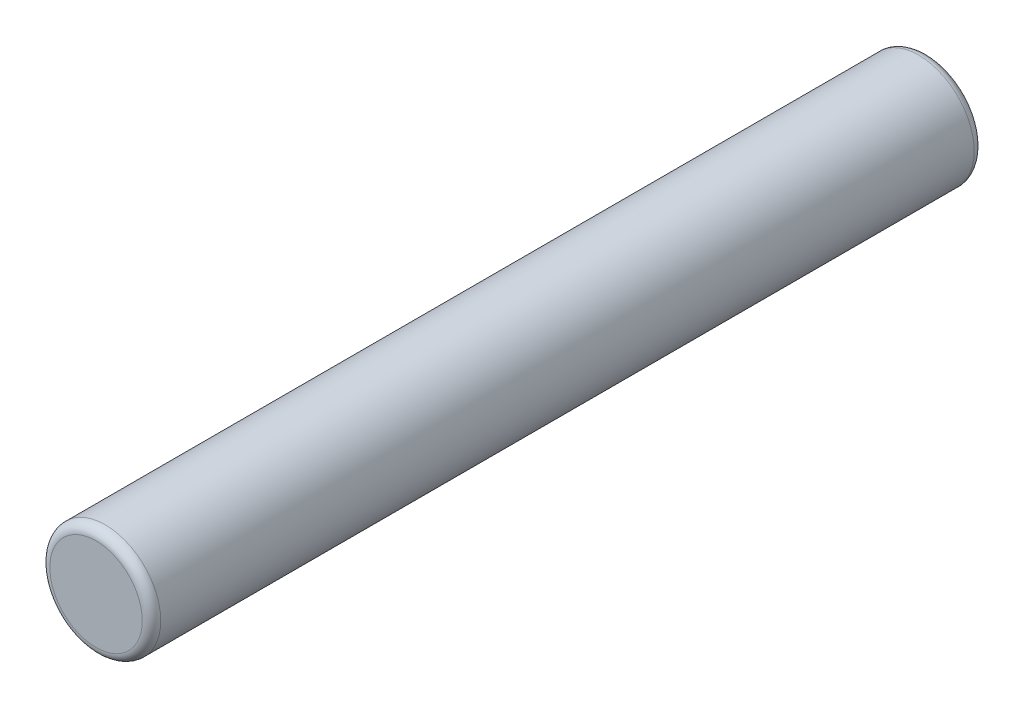
ISO-10303-21;
HEADER;
FILE_DESCRIPTION(('STEP AP214'),'2;1');
FILE_NAME('part.step','',(''),(''),'','','');
FILE_SCHEMA(('AUTOMOTIVE_DESIGN { 1 0 10303 214 1 1 1 1 }'));
ENDSEC;
DATA;
#1=APPLICATION_CONTEXT('core data for automotive mechanical design processes');
#2=APPLICATION_PROTOCOL_DEFINITION('international standard','automotive_design',2000,#1);
#3=PRODUCT_CONTEXT('',#1,'mechanical');
#4=PRODUCT('Part','Part','',(#3));
#5=PRODUCT_RELATED_PRODUCT_CATEGORY('part','',(#4));
#6=PRODUCT_DEFINITION_FORMATION('','',#4);
#7=PRODUCT_DEFINITION_CONTEXT('part definition',#1,'design');
#8=PRODUCT_DEFINITION('design','',#6,#7);
#9=PRODUCT_DEFINITION_SHAPE('','',#8);
#10=(LENGTH_UNIT() NAMED_UNIT(*) SI_UNIT(.MILLI.,.METRE.));
#11=(NAMED_UNIT(*) PLANE_ANGLE_UNIT() SI_UNIT($,.RADIAN.));
#12=(NAMED_UNIT(*) SI_UNIT($,.STERADIAN.) SOLID_ANGLE_UNIT());
#13=UNCERTAINTY_MEASURE_WITH_UNIT(LENGTH_MEASURE(1.E-05),#10,'distance_accuracy_value','');
#14=(GEOMETRIC_REPRESENTATION_CONTEXT(3) GLOBAL_UNCERTAINTY_ASSIGNED_CONTEXT((#13)) GLOBAL_UNIT_ASSIGNED_CONTEXT((#10,
#11,#12)) REPRESENTATION_CONTEXT('',''));
#15=CARTESIAN_POINT('',(0.,0.,0.));
#16=DIRECTION('',(0.,0.,1.));
#17=DIRECTION('',(1.,0.,0.));
#18=AXIS2_PLACEMENT_3D('',#15,#16,#17);
#19=CARTESIAN_POINT('',(0.,0.,22.5));
#20=DIRECTION('',(0.,0.,-1.));
#21=DIRECTION('',(-1.,0.,0.));
#22=AXIS2_PLACEMENT_3D('',#19,#20,#21);
#23=CYLINDRICAL_SURFACE('',#22,3.);
#24=CARTESIAN_POINT('',(0.,0.,-22.));
#25=DIRECTION('',(0.,0.,1.));
#26=DIRECTION('',(1.,0.,0.));
#27=AXIS2_PLACEMENT_3D('',#24,#25,#26);
#28=CIRCLE('',#27,3.);
#29=CARTESIAN_POINT('',(-3.,0.,-22.));
#30=VERTEX_POINT('',#29);
#31=EDGE_CURVE('E42',#30,#30,#28,.T.);
#32=CARTESIAN_POINT('',(0.,0.,22.));
#33=DIRECTION('',(0.,0.,1.));
#34=DIRECTION('',(1.,0.,0.));
#35=AXIS2_PLACEMENT_3D('',#32,#33,#34);
#36=CIRCLE('',#35,3.);
#37=CARTESIAN_POINT('',(-3.,0.,22.));
#38=VERTEX_POINT('',#37);
#39=EDGE_CURVE('E46',#38,#38,#36,.F.);
#40=CARTESIAN_POINT('',(-3.,0.,-22.));
#41=CARTESIAN_POINT('',(-3.,0.,-21.5416666666667));
#42=CARTESIAN_POINT('',(-3.,0.,-21.0833333333333));
#43=CARTESIAN_POINT('',(-3.,0.,-20.1666666666667));
#44=CARTESIAN_POINT('',(-3.,0.,-19.7083333333333));
#45=CARTESIAN_POINT('',(-3.,0.,-18.7916666666667));
#46=CARTESIAN_POINT('',(-3.,0.,-18.3333333333333));
#47=CARTESIAN_POINT('',(-3.,0.,-17.4166666666667));
#48=CARTESIAN_POINT('',(-3.,0.,-16.9583333333333));
#49=CARTESIAN_POINT('',(-3.,0.,-16.0416666666667));
#50=CARTESIAN_POINT('',(-3.,0.,-15.5833333333333));
#51=CARTESIAN_POINT('',(-3.,0.,-14.6666666666667));
#52=CARTESIAN_POINT('',(-3.,0.,-14.2083333333333));
#53=CARTESIAN_POINT('',(-3.,0.,-13.2916666666667));
#54=CARTESIAN_POINT('',(-3.,0.,-12.8333333333333));
#55=CARTESIAN_POINT('',(-3.,0.,-11.9166666666667));
#56=CARTESIAN_POINT('',(-3.,0.,-11.4583333333333));
#57=CARTESIAN_POINT('',(-3.,0.,-10.5416666666667));
#58=CARTESIAN_POINT('',(-3.,0.,-10.0833333333333));
#59=CARTESIAN_POINT('',(-3.,0.,-9.16666666666667));
#60=CARTESIAN_POINT('',(-3.,0.,-8.70833333333334));
#61=CARTESIAN_POINT('',(-3.,0.,-7.79166666666667));
#62=CARTESIAN_POINT('',(-3.,0.,-7.33333333333334));
#63=CARTESIAN_POINT('',(-3.,0.,-6.41666666666667));
#64=CARTESIAN_POINT('',(-3.,0.,-5.95833333333334));
#65=CARTESIAN_POINT('',(-3.,0.,-5.04166666666667));
#66=CARTESIAN_POINT('',(-3.,0.,-4.58333333333334));
#67=CARTESIAN_POINT('',(-3.,0.,-3.66666666666667));
#68=CARTESIAN_POINT('',(-3.,0.,-3.20833333333334));
#69=CARTESIAN_POINT('',(-3.,0.,-2.29166666666667));
#70=CARTESIAN_POINT('',(-3.,0.,-1.83333333333334));
#71=CARTESIAN_POINT('',(-3.,0.,-0.916666666666671));
#72=CARTESIAN_POINT('',(-3.,0.,-0.458333333333337));
#73=CARTESIAN_POINT('',(-3.,0.,0.45833333333333));
#74=CARTESIAN_POINT('',(-3.,0.,0.916666666666664));
#75=CARTESIAN_POINT('',(-3.,0.,1.83333333333333));
#76=CARTESIAN_POINT('',(-3.,0.,2.29166666666667));
#77=CARTESIAN_POINT('',(-3.,0.,3.20833333333333));
#78=CARTESIAN_POINT('',(-3.,0.,3.66666666666666));
#79=CARTESIAN_POINT('',(-3.,0.,4.58333333333333));
#80=CARTESIAN_POINT('',(-3.,0.,5.04166666666666));
#81=CARTESIAN_POINT('',(-3.,0.,5.95833333333333));
#82=CARTESIAN_POINT('',(-3.,0.,6.41666666666667));
#83=CARTESIAN_POINT('',(-3.,0.,7.33333333333333));
#84=CARTESIAN_POINT('',(-3.,0.,7.79166666666666));
#85=CARTESIAN_POINT('',(-3.,0.,8.70833333333333));
#86=CARTESIAN_POINT('',(-3.,0.,9.16666666666666));
#87=CARTESIAN_POINT('',(-3.,0.,10.0833333333333));
#88=CARTESIAN_POINT('',(-3.,0.,10.5416666666667));
#89=CARTESIAN_POINT('',(-3.,0.,11.4583333333333));
#90=CARTESIAN_POINT('',(-3.,0.,11.9166666666667));
#91=CARTESIAN_POINT('',(-3.,0.,12.8333333333333));
#92=CARTESIAN_POINT('',(-3.,0.,13.2916666666667));
#93=CARTESIAN_POINT('',(-3.,0.,14.2083333333333));
#94=CARTESIAN_POINT('',(-3.,0.,14.6666666666667));
#95=CARTESIAN_POINT('',(-3.,0.,15.5833333333333));
#96=CARTESIAN_POINT('',(-3.,0.,16.0416666666667));
#97=CARTESIAN_POINT('',(-3.,0.,16.9583333333333));
#98=CARTESIAN_POINT('',(-3.,0.,17.4166666666667));
#99=CARTESIAN_POINT('',(-3.,0.,18.3333333333333));
#100=CARTESIAN_POINT('',(-3.,0.,18.7916666666667));
#101=CARTESIAN_POINT('',(-3.,0.,19.7083333333333));
#102=CARTESIAN_POINT('',(-3.,0.,20.1666666666667));
#103=CARTESIAN_POINT('',(-3.,0.,21.0833333333333));
#104=CARTESIAN_POINT('',(-3.,0.,21.5416666666667));
#105=CARTESIAN_POINT('',(-3.,0.,22.));
#106=B_SPLINE_CURVE_WITH_KNOTS('',3,(#40,#41,#42,#43,#44,#45,#46,#47,#48,#49,#50,#51,#52,#53,
#54,#55,#56,#57,#58,#59,#60,#61,#62,#63,#64,#65,#66,#67,#68,#69,#70,#71,#72,#73,#74,#75,#76,#77,
#78,#79,#80,#81,#82,#83,#84,#85,#86,#87,#88,#89,#90,#91,#92,#93,#94,#95,#96,#97,#98,#99,#100,
#101,#102,#103,#104,#105),.UNSPECIFIED.,.F.,.F.,(4,2,2,2,2,2,2,2,2,2,2,2,2,2,2,2,2,2,2,2,2,2,2,
2,2,2,2,2,2,2,2,2,4),(0.,1.375,2.75,4.125,5.50000000000001,6.875,8.25,9.625,11.,12.375,13.75,
15.125,16.5,17.875,19.25,20.625,22.,23.375,24.75,26.125,27.5,28.875,30.25,31.625,33.,34.375,
35.75,37.125,38.5,39.875,41.25,42.625,44.),.UNSPECIFIED.);
#107=EDGE_CURVE('BSEAM31',#30,#38,#106,.T.);
#108=ORIENTED_EDGE('',*,*,#31,.T.);
#109=ORIENTED_EDGE('',*,*,#39,.T.);
#110=ORIENTED_EDGE('',*,*,#107,.T.);
#111=ORIENTED_EDGE('',*,*,#107,.F.);
#112=EDGE_LOOP('',(#108,#110,#109,#111));
#113=FACE_BOUND('',#112,.T.);
#114=ADVANCED_FACE('F31',(#113),#23,.T.);
#115=CARTESIAN_POINT('',(0.,0.,22.5));
#116=DIRECTION('',(0.,0.,1.));
#117=DIRECTION('',(1.,0.,0.));
#118=AXIS2_PLACEMENT_3D('',#115,#116,#117);
#119=PLANE('',#118);
#120=CARTESIAN_POINT('',(0.,0.,22.5));
#121=DIRECTION('',(0.,0.,1.));
#122=DIRECTION('',(1.,0.,0.));
#123=AXIS2_PLACEMENT_3D('',#120,#121,#122);
#124=CIRCLE('',#123,2.5);
#125=CARTESIAN_POINT('',(2.5,0.,22.5));
#126=VERTEX_POINT('',#125);
#127=EDGE_CURVE('E10',#126,#126,#124,.T.);
#128=ORIENTED_EDGE('',*,*,#127,.T.);
#129=EDGE_LOOP('',(#128));
#130=FACE_BOUND('',#129,.T.);
#131=ADVANCED_FACE('F62',(#130),#119,.T.);
#132=CARTESIAN_POINT('',(0.,0.,-22.5));
#133=DIRECTION('',(0.,0.,1.));
#134=DIRECTION('',(1.,0.,0.));
#135=AXIS2_PLACEMENT_3D('',#132,#133,#134);
#136=PLANE('',#135);
#137=CARTESIAN_POINT('',(0.,0.,-22.5));
#138=DIRECTION('',(0.,0.,1.));
#139=DIRECTION('',(1.,0.,0.));
#140=AXIS2_PLACEMENT_3D('',#137,#138,#139);
#141=CIRCLE('',#140,2.5);
#142=CARTESIAN_POINT('',(2.5,0.,-22.5));
#143=VERTEX_POINT('',#142);
#144=EDGE_CURVE('E38',#143,#143,#141,.F.);
#145=ORIENTED_EDGE('',*,*,#144,.T.);
#146=EDGE_LOOP('',(#145));
#147=FACE_BOUND('',#146,.T.);
#148=ADVANCED_FACE('F59',(#147),#136,.F.);
#149=CARTESIAN_POINT('',(0.,0.,-22.));
#150=DIRECTION('',(0.,0.,1.));
#151=DIRECTION('',(1.,0.,0.));
#152=AXIS2_PLACEMENT_3D('',#149,#150,#151);
#153=TOROIDAL_SURFACE('',#152,2.5,0.5);
#154=ORIENTED_EDGE('',*,*,#144,.F.);
#155=EDGE_LOOP('',(#154));
#156=FACE_BOUND('',#155,.T.);
#157=ORIENTED_EDGE('',*,*,#31,.F.);
#158=EDGE_LOOP('',(#157));
#159=FACE_BOUND('',#158,.T.);
#160=ADVANCED_FACE('F55',(#156,#159),#153,.T.);
#161=CARTESIAN_POINT('',(0.,0.,22.));
#162=DIRECTION('',(0.,0.,1.));
#163=DIRECTION('',(1.,0.,0.));
#164=AXIS2_PLACEMENT_3D('',#161,#162,#163);
#165=TOROIDAL_SURFACE('',#164,2.5,0.5);
#166=ORIENTED_EDGE('',*,*,#39,.F.);
#167=EDGE_LOOP('',(#166));
#168=FACE_BOUND('',#167,.T.);
#169=ORIENTED_EDGE('',*,*,#127,.F.);
#170=EDGE_LOOP('',(#169));
#171=FACE_BOUND('',#170,.T.);
#172=ADVANCED_FACE('F33',(#168,#171),#165,.T.);
#173=CLOSED_SHELL('',(#114,#131,#148,#160,#172));
#174=MANIFOLD_SOLID_BREP('B2',#173);
#175=ADVANCED_BREP_SHAPE_REPRESENTATION('',(#18,#174),#14);
#176=SHAPE_DEFINITION_REPRESENTATION(#9,#175);
ENDSEC;
END-ISO-10303-21;
